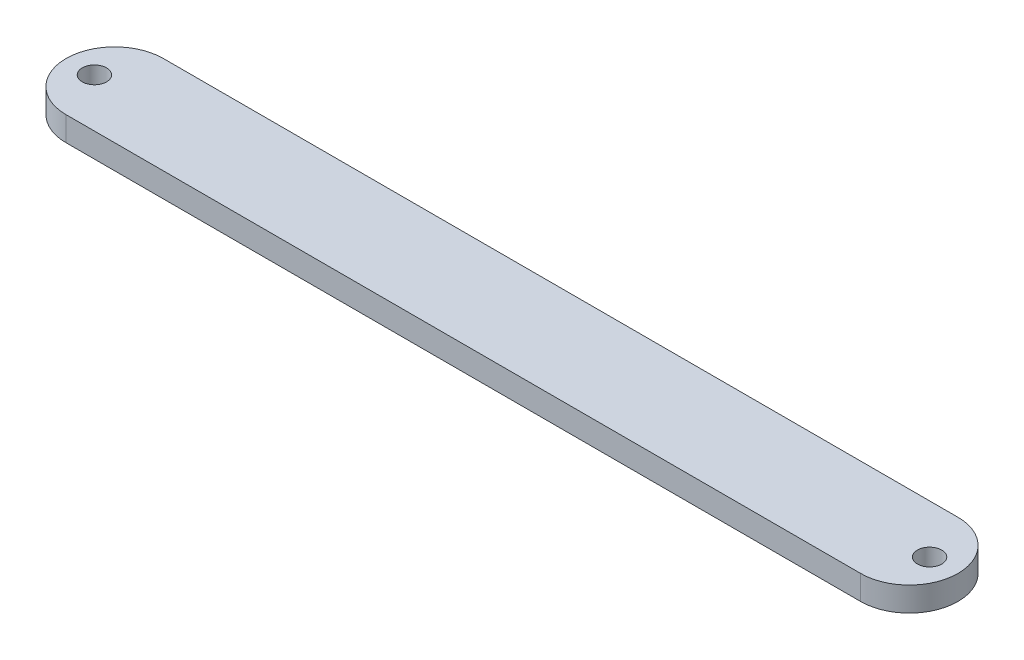
ISO-10303-21;
HEADER;
FILE_DESCRIPTION(('STEP AP214'),'2;1');
FILE_NAME('part.step','',(''),(''),'','','');
FILE_SCHEMA(('AUTOMOTIVE_DESIGN { 1 0 10303 214 1 1 1 1 }'));
ENDSEC;
DATA;
#1=APPLICATION_CONTEXT('core data for automotive mechanical design processes');
#2=APPLICATION_PROTOCOL_DEFINITION('international standard','automotive_design',2000,#1);
#3=PRODUCT_CONTEXT('',#1,'mechanical');
#4=PRODUCT('Part','Part','',(#3));
#5=PRODUCT_RELATED_PRODUCT_CATEGORY('part','',(#4));
#6=PRODUCT_DEFINITION_FORMATION('','',#4);
#7=PRODUCT_DEFINITION_CONTEXT('part definition',#1,'design');
#8=PRODUCT_DEFINITION('design','',#6,#7);
#9=PRODUCT_DEFINITION_SHAPE('','',#8);
#10=(LENGTH_UNIT() NAMED_UNIT(*) SI_UNIT(.MILLI.,.METRE.));
#11=(NAMED_UNIT(*) PLANE_ANGLE_UNIT() SI_UNIT($,.RADIAN.));
#12=(NAMED_UNIT(*) SI_UNIT($,.STERADIAN.) SOLID_ANGLE_UNIT());
#13=UNCERTAINTY_MEASURE_WITH_UNIT(LENGTH_MEASURE(1.E-05),#10,'distance_accuracy_value','');
#14=(GEOMETRIC_REPRESENTATION_CONTEXT(3) GLOBAL_UNCERTAINTY_ASSIGNED_CONTEXT((#13)) GLOBAL_UNIT_ASSIGNED_CONTEXT((#10,
#11,#12)) REPRESENTATION_CONTEXT('',''));
#15=CARTESIAN_POINT('',(0.,0.,0.));
#16=DIRECTION('',(0.,0.,1.));
#17=DIRECTION('',(1.,0.,0.));
#18=AXIS2_PLACEMENT_3D('',#15,#16,#17);
#19=CARTESIAN_POINT('',(-49.,3.,0.));
#20=DIRECTION('',(0.,1.,0.));
#21=DIRECTION('',(0.,0.,1.));
#22=AXIS2_PLACEMENT_3D('',#19,#20,#21);
#23=PLANE('',#22);
#24=CARTESIAN_POINT('',(-51.5,3.,0.));
#25=DIRECTION('',(0.,1.,0.));
#26=DIRECTION('',(0.,0.,1.));
#27=AXIS2_PLACEMENT_3D('',#24,#25,#26);
#28=CIRCLE('',#27,1.5);
#29=CARTESIAN_POINT('',(-51.5,3.,1.5));
#30=VERTEX_POINT('',#29);
#31=EDGE_CURVE('E135',#30,#30,#28,.T.);
#32=ORIENTED_EDGE('',*,*,#31,.F.);
#33=EDGE_LOOP('',(#32));
#34=FACE_BOUND('',#33,.T.);
#35=CARTESIAN_POINT('',(-49.,3.,0.));
#36=DIRECTION('',(0.,1.,0.));
#37=DIRECTION('',(0.,0.,1.));
#38=AXIS2_PLACEMENT_3D('',#35,#36,#37);
#39=CIRCLE('',#38,6.00000000000001);
#40=CARTESIAN_POINT('',(-49.,3.,-6.00000000000001));
#41=VERTEX_POINT('',#40);
#42=CARTESIAN_POINT('',(-49.,3.,6.00000000000001));
#43=VERTEX_POINT('',#42);
#44=EDGE_CURVE('E119',#41,#43,#39,.T.);
#45=ORIENTED_EDGE('',*,*,#44,.T.);
#46=DIRECTION('',(1.,0.,0.));
#47=VECTOR('',#46,1.);
#48=CARTESIAN_POINT('',(-49.,3.,6.00000000000001));
#49=LINE('',#48,#47);
#50=CARTESIAN_POINT('',(49.,3.,6.00000000000001));
#51=VERTEX_POINT('',#50);
#52=EDGE_CURVE('E112',#43,#51,#49,.T.);
#53=ORIENTED_EDGE('',*,*,#52,.T.);
#54=CARTESIAN_POINT('',(49.,3.,0.));
#55=DIRECTION('',(0.,1.,0.));
#56=DIRECTION('',(0.,0.,1.));
#57=AXIS2_PLACEMENT_3D('',#54,#55,#56);
#58=CIRCLE('',#57,6.00000000000001);
#59=CARTESIAN_POINT('',(49.,3.,-6.00000000000002));
#60=VERTEX_POINT('',#59);
#61=EDGE_CURVE('E118',#51,#60,#58,.T.);
#62=ORIENTED_EDGE('',*,*,#61,.T.);
#63=DIRECTION('',(1.,0.,0.));
#64=VECTOR('',#63,1.);
#65=CARTESIAN_POINT('',(-49.,3.,-6.00000000000001));
#66=LINE('',#65,#64);
#67=EDGE_CURVE('E128',#41,#60,#66,.T.);
#68=ORIENTED_EDGE('',*,*,#67,.F.);
#69=EDGE_LOOP('',(#45,#53,#62,#68));
#70=FACE_BOUND('',#69,.T.);
#71=CARTESIAN_POINT('',(51.5,3.,0.));
#72=DIRECTION('',(0.,1.,0.));
#73=DIRECTION('',(0.,0.,1.));
#74=AXIS2_PLACEMENT_3D('',#71,#72,#73);
#75=CIRCLE('',#74,1.5);
#76=CARTESIAN_POINT('',(51.5,3.,1.5));
#77=VERTEX_POINT('',#76);
#78=EDGE_CURVE('E148',#77,#77,#75,.T.);
#79=ORIENTED_EDGE('',*,*,#78,.F.);
#80=EDGE_LOOP('',(#79));
#81=FACE_BOUND('',#80,.T.);
#82=ADVANCED_FACE('F69',(#34,#70,#81),#23,.T.);
#83=CARTESIAN_POINT('',(-49.,0.,0.));
#84=DIRECTION('',(0.,1.,0.));
#85=DIRECTION('',(0.,0.,1.));
#86=AXIS2_PLACEMENT_3D('',#83,#84,#85);
#87=PLANE('',#86);
#88=CARTESIAN_POINT('',(-49.,0.,0.));
#89=DIRECTION('',(0.,1.,0.));
#90=DIRECTION('',(0.,0.,1.));
#91=AXIS2_PLACEMENT_3D('',#88,#89,#90);
#92=CIRCLE('',#91,6.00000000000001);
#93=CARTESIAN_POINT('',(-49.,0.,-6.00000000000001));
#94=VERTEX_POINT('',#93);
#95=CARTESIAN_POINT('',(-49.,0.,6.00000000000001));
#96=VERTEX_POINT('',#95);
#97=EDGE_CURVE('E133',#94,#96,#92,.T.);
#98=ORIENTED_EDGE('',*,*,#97,.F.);
#99=DIRECTION('',(1.,0.,0.));
#100=VECTOR('',#99,1.);
#101=CARTESIAN_POINT('',(-49.,0.,-6.00000000000001));
#102=LINE('',#101,#100);
#103=CARTESIAN_POINT('',(49.,0.,-6.00000000000002));
#104=VERTEX_POINT('',#103);
#105=EDGE_CURVE('E139',#94,#104,#102,.T.);
#106=ORIENTED_EDGE('',*,*,#105,.T.);
#107=CARTESIAN_POINT('',(49.,0.,0.));
#108=DIRECTION('',(0.,1.,0.));
#109=DIRECTION('',(0.,0.,1.));
#110=AXIS2_PLACEMENT_3D('',#107,#108,#109);
#111=CIRCLE('',#110,6.00000000000001);
#112=CARTESIAN_POINT('',(49.,0.,6.00000000000001));
#113=VERTEX_POINT('',#112);
#114=EDGE_CURVE('E137',#113,#104,#111,.T.);
#115=ORIENTED_EDGE('',*,*,#114,.F.);
#116=DIRECTION('',(1.,0.,0.));
#117=VECTOR('',#116,1.);
#118=CARTESIAN_POINT('',(-49.,0.,6.00000000000001));
#119=LINE('',#118,#117);
#120=EDGE_CURVE('E124',#96,#113,#119,.T.);
#121=ORIENTED_EDGE('',*,*,#120,.F.);
#122=EDGE_LOOP('',(#98,#106,#115,#121));
#123=FACE_BOUND('',#122,.T.);
#124=CARTESIAN_POINT('',(-51.5,0.,0.));
#125=DIRECTION('',(0.,1.,0.));
#126=DIRECTION('',(0.,0.,1.));
#127=AXIS2_PLACEMENT_3D('',#124,#125,#126);
#128=CIRCLE('',#127,1.5);
#129=CARTESIAN_POINT('',(-51.5,0.,1.5));
#130=VERTEX_POINT('',#129);
#131=EDGE_CURVE('E145',#130,#130,#128,.T.);
#132=ORIENTED_EDGE('',*,*,#131,.T.);
#133=EDGE_LOOP('',(#132));
#134=FACE_BOUND('',#133,.T.);
#135=CARTESIAN_POINT('',(51.5,0.,0.));
#136=DIRECTION('',(0.,1.,0.));
#137=DIRECTION('',(0.,0.,1.));
#138=AXIS2_PLACEMENT_3D('',#135,#136,#137);
#139=CIRCLE('',#138,1.5);
#140=CARTESIAN_POINT('',(51.5,0.,1.5));
#141=VERTEX_POINT('',#140);
#142=EDGE_CURVE('E151',#141,#141,#139,.T.);
#143=ORIENTED_EDGE('',*,*,#142,.T.);
#144=EDGE_LOOP('',(#143));
#145=FACE_BOUND('',#144,.T.);
#146=ADVANCED_FACE('F160',(#123,#134,#145),#87,.F.);
#147=CARTESIAN_POINT('',(-49.,3.,0.));
#148=DIRECTION('',(0.,-1.,0.));
#149=DIRECTION('',(0.,0.,-1.));
#150=AXIS2_PLACEMENT_3D('',#147,#148,#149);
#151=CYLINDRICAL_SURFACE('',#150,6.00000000000001);
#152=ORIENTED_EDGE('',*,*,#97,.T.);
#153=DIRECTION('',(0.,-1.,0.));
#154=VECTOR('',#153,1.);
#155=CARTESIAN_POINT('',(-49.,3.,6.00000000000001));
#156=LINE('',#155,#154);
#157=EDGE_CURVE('E12',#43,#96,#156,.T.);
#158=ORIENTED_EDGE('',*,*,#157,.F.);
#159=ORIENTED_EDGE('',*,*,#44,.F.);
#160=DIRECTION('',(0.,-1.,0.));
#161=VECTOR('',#160,1.);
#162=CARTESIAN_POINT('',(-49.,3.,-6.00000000000001));
#163=LINE('',#162,#161);
#164=EDGE_CURVE('E86',#41,#94,#163,.T.);
#165=ORIENTED_EDGE('',*,*,#164,.T.);
#166=EDGE_LOOP('',(#152,#158,#159,#165));
#167=FACE_BOUND('',#166,.T.);
#168=ADVANCED_FACE('F71',(#167),#151,.T.);
#169=CARTESIAN_POINT('',(-49.,3.,6.00000000000001));
#170=DIRECTION('',(0.,0.,-1.));
#171=DIRECTION('',(-1.,0.,0.));
#172=AXIS2_PLACEMENT_3D('',#169,#170,#171);
#173=PLANE('',#172);
#174=ORIENTED_EDGE('',*,*,#120,.T.);
#175=DIRECTION('',(0.,-1.,0.));
#176=VECTOR('',#175,1.);
#177=CARTESIAN_POINT('',(49.,3.,6.00000000000001));
#178=LINE('',#177,#176);
#179=EDGE_CURVE('E78',#51,#113,#178,.T.);
#180=ORIENTED_EDGE('',*,*,#179,.F.);
#181=ORIENTED_EDGE('',*,*,#52,.F.);
#182=ORIENTED_EDGE('',*,*,#157,.T.);
#183=EDGE_LOOP('',(#174,#180,#181,#182));
#184=FACE_BOUND('',#183,.T.);
#185=ADVANCED_FACE('F123',(#184),#173,.F.);
#186=CARTESIAN_POINT('',(49.,3.,0.));
#187=DIRECTION('',(0.,-1.,0.));
#188=DIRECTION('',(0.,0.,-1.));
#189=AXIS2_PLACEMENT_3D('',#186,#187,#188);
#190=CYLINDRICAL_SURFACE('',#189,6.00000000000001);
#191=ORIENTED_EDGE('',*,*,#114,.T.);
#192=DIRECTION('',(0.,-1.,0.));
#193=VECTOR('',#192,1.);
#194=CARTESIAN_POINT('',(49.,3.,-6.00000000000002));
#195=LINE('',#194,#193);
#196=EDGE_CURVE('E101',#60,#104,#195,.T.);
#197=ORIENTED_EDGE('',*,*,#196,.F.);
#198=ORIENTED_EDGE('',*,*,#61,.F.);
#199=ORIENTED_EDGE('',*,*,#179,.T.);
#200=EDGE_LOOP('',(#191,#197,#198,#199));
#201=FACE_BOUND('',#200,.T.);
#202=ADVANCED_FACE('F127',(#201),#190,.T.);
#203=CARTESIAN_POINT('',(-49.,3.,-6.00000000000001));
#204=DIRECTION('',(0.,0.,-1.));
#205=DIRECTION('',(-1.,0.,0.));
#206=AXIS2_PLACEMENT_3D('',#203,#204,#205);
#207=PLANE('',#206);
#208=ORIENTED_EDGE('',*,*,#105,.F.);
#209=ORIENTED_EDGE('',*,*,#164,.F.);
#210=ORIENTED_EDGE('',*,*,#67,.T.);
#211=ORIENTED_EDGE('',*,*,#196,.T.);
#212=EDGE_LOOP('',(#208,#209,#210,#211));
#213=FACE_BOUND('',#212,.T.);
#214=ADVANCED_FACE('F172',(#213),#207,.T.);
#215=CARTESIAN_POINT('',(-51.5,3.,0.));
#216=DIRECTION('',(0.,-1.,0.));
#217=DIRECTION('',(0.,0.,-1.));
#218=AXIS2_PLACEMENT_3D('',#215,#216,#217);
#219=CYLINDRICAL_SURFACE('',#218,1.5);
#220=ORIENTED_EDGE('',*,*,#31,.T.);
#221=EDGE_LOOP('',(#220));
#222=FACE_BOUND('',#221,.T.);
#223=ORIENTED_EDGE('',*,*,#131,.F.);
#224=EDGE_LOOP('',(#223));
#225=FACE_BOUND('',#224,.T.);
#226=ADVANCED_FACE('F169',(#222,#225),#219,.F.);
#227=CARTESIAN_POINT('',(51.5,3.,0.));
#228=DIRECTION('',(0.,-1.,0.));
#229=DIRECTION('',(0.,0.,-1.));
#230=AXIS2_PLACEMENT_3D('',#227,#228,#229);
#231=CYLINDRICAL_SURFACE('',#230,1.5);
#232=ORIENTED_EDGE('',*,*,#78,.T.);
#233=EDGE_LOOP('',(#232));
#234=FACE_BOUND('',#233,.T.);
#235=ORIENTED_EDGE('',*,*,#142,.F.);
#236=EDGE_LOOP('',(#235));
#237=FACE_BOUND('',#236,.T.);
#238=ADVANCED_FACE('F157',(#234,#237),#231,.F.);
#239=CLOSED_SHELL('',(#82,#146,#168,#185,#202,#214,#226,#238));
#240=MANIFOLD_SOLID_BREP('B2',#239);
#241=ADVANCED_BREP_SHAPE_REPRESENTATION('',(#18,#240),#14);
#242=SHAPE_DEFINITION_REPRESENTATION(#9,#241);
ENDSEC;
END-ISO-10303-21;
